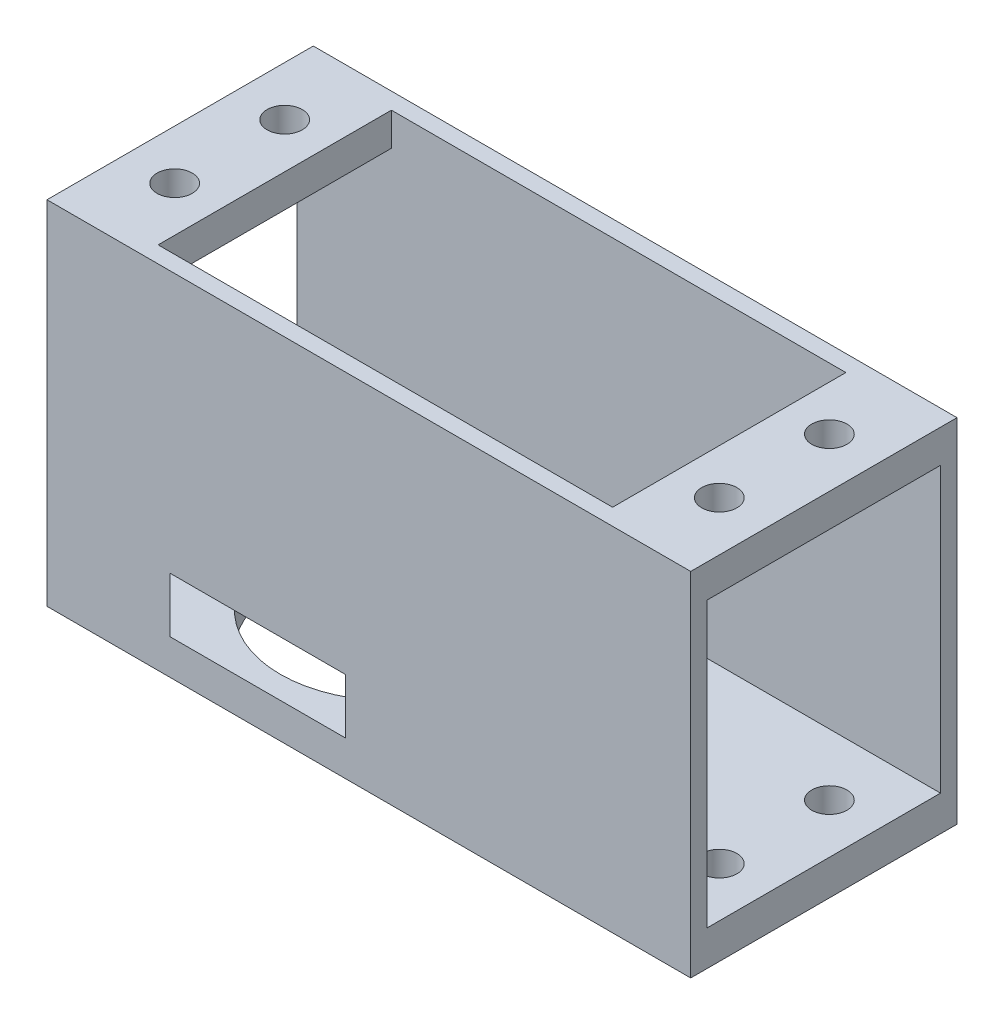
ISO-10303-21;
HEADER;
FILE_DESCRIPTION(('STEP AP214'),'2;1');
FILE_NAME('part.step','',(''),(''),'','','');
FILE_SCHEMA(('AUTOMOTIVE_DESIGN { 1 0 10303 214 1 1 1 1 }'));
ENDSEC;
DATA;
#1=APPLICATION_CONTEXT('core data for automotive mechanical design processes');
#2=APPLICATION_PROTOCOL_DEFINITION('international standard','automotive_design',2000,#1);
#3=PRODUCT_CONTEXT('',#1,'mechanical');
#4=PRODUCT('Part','Part','',(#3));
#5=PRODUCT_RELATED_PRODUCT_CATEGORY('part','',(#4));
#6=PRODUCT_DEFINITION_FORMATION('','',#4);
#7=PRODUCT_DEFINITION_CONTEXT('part definition',#1,'design');
#8=PRODUCT_DEFINITION('design','',#6,#7);
#9=PRODUCT_DEFINITION_SHAPE('','',#8);
#10=(LENGTH_UNIT() NAMED_UNIT(*) SI_UNIT(.MILLI.,.METRE.));
#11=(NAMED_UNIT(*) PLANE_ANGLE_UNIT() SI_UNIT($,.RADIAN.));
#12=(NAMED_UNIT(*) SI_UNIT($,.STERADIAN.) SOLID_ANGLE_UNIT());
#13=UNCERTAINTY_MEASURE_WITH_UNIT(LENGTH_MEASURE(1.E-05),#10,'distance_accuracy_value','');
#14=(GEOMETRIC_REPRESENTATION_CONTEXT(3) GLOBAL_UNCERTAINTY_ASSIGNED_CONTEXT((#13)) GLOBAL_UNIT_ASSIGNED_CONTEXT((#10,
#11,#12)) REPRESENTATION_CONTEXT('',''));
#15=CARTESIAN_POINT('',(0.,0.,0.));
#16=DIRECTION('',(0.,0.,1.));
#17=DIRECTION('',(1.,0.,0.));
#18=AXIS2_PLACEMENT_3D('',#15,#16,#17);
#19=CARTESIAN_POINT('',(-19.15,15.4,10.6));
#20=DIRECTION('',(0.,0.,-1.));
#21=DIRECTION('',(-1.,0.,0.));
#22=AXIS2_PLACEMENT_3D('',#19,#20,#21);
#23=PLANE('',#22);
#24=DIRECTION('',(0.,-1.,0.));
#25=VECTOR('',#24,1.);
#26=CARTESIAN_POINT('',(9.89393753770459,-500.,10.6));
#27=LINE('',#26,#25);
#28=CARTESIAN_POINT('',(9.89393753770459,20.4,10.6));
#29=VERTEX_POINT('',#28);
#30=CARTESIAN_POINT('',(9.89393753770459,15.4,10.6));
#31=VERTEX_POINT('',#30);
#32=EDGE_CURVE('E225',#29,#31,#27,.T.);
#33=ORIENTED_EDGE('',*,*,#32,.F.);
#34=DIRECTION('',(1.,0.,0.));
#35=VECTOR('',#34,1.);
#36=CARTESIAN_POINT('',(-19.15,20.4,10.6));
#37=LINE('',#36,#35);
#38=CARTESIAN_POINT('',(-9.89393753770459,20.4,10.6));
#39=VERTEX_POINT('',#38);
#40=EDGE_CURVE('E208',#39,#29,#37,.T.);
#41=ORIENTED_EDGE('',*,*,#40,.F.);
#42=DIRECTION('',(0.,-1.,0.));
#43=VECTOR('',#42,1.);
#44=CARTESIAN_POINT('',(-9.89393753770459,-500.,10.6));
#45=LINE('',#44,#43);
#46=CARTESIAN_POINT('',(-9.89393753770459,15.4,10.6));
#47=VERTEX_POINT('',#46);
#48=EDGE_CURVE('E217',#47,#39,#45,.F.);
#49=ORIENTED_EDGE('',*,*,#48,.F.);
#50=DIRECTION('',(1.,0.,0.));
#51=VECTOR('',#50,1.);
#52=CARTESIAN_POINT('',(-19.15,15.4,10.6));
#53=LINE('',#52,#51);
#54=CARTESIAN_POINT('',(-19.15,15.4,10.6));
#55=VERTEX_POINT('',#54);
#56=EDGE_CURVE('E357',#55,#47,#53,.T.);
#57=ORIENTED_EDGE('',*,*,#56,.F.);
#58=DIRECTION('',(0.,1.,0.));
#59=VECTOR('',#58,1.);
#60=CARTESIAN_POINT('',(-19.15,15.4,10.6));
#61=LINE('',#60,#59);
#62=CARTESIAN_POINT('',(-19.15,41.2,10.6));
#63=VERTEX_POINT('',#62);
#64=EDGE_CURVE('E348',#55,#63,#61,.T.);
#65=ORIENTED_EDGE('',*,*,#64,.T.);
#66=DIRECTION('',(1.,0.,0.));
#67=VECTOR('',#66,1.);
#68=CARTESIAN_POINT('',(-19.15,41.2,10.6));
#69=LINE('',#68,#67);
#70=CARTESIAN_POINT('',(-10.55,41.2,10.6));
#71=VERTEX_POINT('',#70);
#72=EDGE_CURVE('E267',#63,#71,#69,.T.);
#73=ORIENTED_EDGE('',*,*,#72,.T.);
#74=DIRECTION('',(0.,1.,0.));
#75=VECTOR('',#74,1.);
#76=CARTESIAN_POINT('',(-10.55,41.2,10.6));
#77=LINE('',#76,#75);
#78=CARTESIAN_POINT('',(-10.55,44.2,10.6));
#79=VERTEX_POINT('',#78);
#80=EDGE_CURVE('E275',#71,#79,#77,.T.);
#81=ORIENTED_EDGE('',*,*,#80,.T.);
#82=DIRECTION('',(1.,0.,0.));
#83=VECTOR('',#82,1.);
#84=CARTESIAN_POINT('',(-19.15,44.2,10.6));
#85=LINE('',#84,#83);
#86=CARTESIAN_POINT('',(30.75,44.2,10.6));
#87=VERTEX_POINT('',#86);
#88=EDGE_CURVE('E352',#79,#87,#85,.T.);
#89=ORIENTED_EDGE('',*,*,#88,.T.);
#90=DIRECTION('',(0.,-1.,0.));
#91=VECTOR('',#90,1.);
#92=CARTESIAN_POINT('',(30.75,44.2,10.6));
#93=LINE('',#92,#91);
#94=CARTESIAN_POINT('',(30.75,41.2,10.6));
#95=VERTEX_POINT('',#94);
#96=EDGE_CURVE('E302',#87,#95,#93,.T.);
#97=ORIENTED_EDGE('',*,*,#96,.T.);
#98=DIRECTION('',(1.,0.,0.));
#99=VECTOR('',#98,1.);
#100=CARTESIAN_POINT('',(30.75,41.2,10.6));
#101=LINE('',#100,#99);
#102=CARTESIAN_POINT('',(39.35,41.2,10.6));
#103=VERTEX_POINT('',#102);
#104=EDGE_CURVE('E297',#95,#103,#101,.T.);
#105=ORIENTED_EDGE('',*,*,#104,.T.);
#106=DIRECTION('',(0.,1.,0.));
#107=VECTOR('',#106,1.);
#108=CARTESIAN_POINT('',(39.35,15.4,10.6));
#109=LINE('',#108,#107);
#110=CARTESIAN_POINT('',(39.35,15.4,10.6));
#111=VERTEX_POINT('',#110);
#112=EDGE_CURVE('E330',#111,#103,#109,.T.);
#113=ORIENTED_EDGE('',*,*,#112,.F.);
#114=EDGE_CURVE('E359',#31,#111,#53,.T.);
#115=ORIENTED_EDGE('',*,*,#114,.F.);
#116=EDGE_LOOP('',(#33,#41,#49,#57,#65,#73,#81,#89,#97,#105,#113,#115));
#117=FACE_BOUND('',#116,.T.);
#118=ADVANCED_FACE('F41',(#117),#23,.T.);
#119=CARTESIAN_POINT('',(-19.15,44.2,12.1));
#120=DIRECTION('',(0.,0.,1.));
#121=DIRECTION('',(1.,0.,0.));
#122=AXIS2_PLACEMENT_3D('',#119,#120,#121);
#123=PLANE('',#122);
#124=DIRECTION('',(1.,0.,0.));
#125=VECTOR('',#124,1.);
#126=CARTESIAN_POINT('',(-19.15,15.4,12.1));
#127=LINE('',#126,#125);
#128=CARTESIAN_POINT('',(-7.98999374217527,15.4,12.1));
#129=VERTEX_POINT('',#128);
#130=CARTESIAN_POINT('',(7.98999374217527,15.4,12.1));
#131=VERTEX_POINT('',#130);
#132=EDGE_CURVE('E201',#129,#131,#127,.T.);
#133=ORIENTED_EDGE('',*,*,#132,.F.);
#134=DIRECTION('',(0.,-1.,0.));
#135=VECTOR('',#134,1.);
#136=CARTESIAN_POINT('',(-7.98999374217527,-500.,12.1));
#137=LINE('',#136,#135);
#138=CARTESIAN_POINT('',(-7.98999374217527,20.4,12.1));
#139=VERTEX_POINT('',#138);
#140=EDGE_CURVE('E216',#139,#129,#137,.T.);
#141=ORIENTED_EDGE('',*,*,#140,.F.);
#142=DIRECTION('',(-1.,0.,0.));
#143=VECTOR('',#142,1.);
#144=CARTESIAN_POINT('',(-19.15,20.4,12.1));
#145=LINE('',#144,#143);
#146=CARTESIAN_POINT('',(7.98999374217527,20.4,12.1));
#147=VERTEX_POINT('',#146);
#148=EDGE_CURVE('E206',#147,#139,#145,.T.);
#149=ORIENTED_EDGE('',*,*,#148,.F.);
#150=DIRECTION('',(0.,-1.,0.));
#151=VECTOR('',#150,1.);
#152=CARTESIAN_POINT('',(7.98999374217527,-500.,12.1));
#153=LINE('',#152,#151);
#154=EDGE_CURVE('E218',#131,#147,#153,.F.);
#155=ORIENTED_EDGE('',*,*,#154,.F.);
#156=EDGE_LOOP('',(#133,#141,#149,#155));
#157=FACE_BOUND('',#156,.T.);
#158=DIRECTION('',(1.,0.,0.));
#159=VECTOR('',#158,1.);
#160=CARTESIAN_POINT('',(-19.15,12.2,12.1));
#161=LINE('',#160,#159);
#162=CARTESIAN_POINT('',(-19.15,12.2,12.1));
#163=VERTEX_POINT('',#162);
#164=CARTESIAN_POINT('',(39.35,12.2,12.1));
#165=VERTEX_POINT('',#164);
#166=EDGE_CURVE('E349',#163,#165,#161,.T.);
#167=ORIENTED_EDGE('',*,*,#166,.T.);
#168=DIRECTION('',(0.,-1.,0.));
#169=VECTOR('',#168,1.);
#170=CARTESIAN_POINT('',(39.35,44.2,12.1));
#171=LINE('',#170,#169);
#172=CARTESIAN_POINT('',(39.35,44.2,12.1));
#173=VERTEX_POINT('',#172);
#174=EDGE_CURVE('E293',#173,#165,#171,.T.);
#175=ORIENTED_EDGE('',*,*,#174,.F.);
#176=DIRECTION('',(1.,0.,0.));
#177=VECTOR('',#176,1.);
#178=CARTESIAN_POINT('',(-19.15,44.2,12.1));
#179=LINE('',#178,#177);
#180=CARTESIAN_POINT('',(-19.15,44.2,12.1));
#181=VERTEX_POINT('',#180);
#182=EDGE_CURVE('E347',#181,#173,#179,.T.);
#183=ORIENTED_EDGE('',*,*,#182,.F.);
#184=DIRECTION('',(0.,-1.,0.));
#185=VECTOR('',#184,1.);
#186=CARTESIAN_POINT('',(-19.15,44.2,12.1));
#187=LINE('',#186,#185);
#188=EDGE_CURVE('E327',#181,#163,#187,.T.);
#189=ORIENTED_EDGE('',*,*,#188,.T.);
#190=EDGE_LOOP('',(#167,#175,#183,#189));
#191=FACE_BOUND('',#190,.T.);
#192=ADVANCED_FACE('F43',(#157,#191),#123,.T.);
#193=CARTESIAN_POINT('',(-19.15,44.2,10.6));
#194=DIRECTION('',(0.,1.,0.));
#195=DIRECTION('',(0.,0.,1.));
#196=AXIS2_PLACEMENT_3D('',#193,#194,#195);
#197=PLANE('',#196);
#198=CARTESIAN_POINT('',(-14.65,44.2,-5.));
#199=DIRECTION('',(0.,1.,0.));
#200=DIRECTION('',(0.,0.,1.));
#201=AXIS2_PLACEMENT_3D('',#198,#199,#200);
#202=CIRCLE('',#201,1.6);
#203=CARTESIAN_POINT('',(-14.65,44.2,-3.4));
#204=VERTEX_POINT('',#203);
#205=EDGE_CURVE('E244',#204,#204,#202,.T.);
#206=ORIENTED_EDGE('',*,*,#205,.F.);
#207=EDGE_LOOP('',(#206));
#208=FACE_BOUND('',#207,.T.);
#209=CARTESIAN_POINT('',(34.85,44.2,5.));
#210=DIRECTION('',(0.,1.,0.));
#211=DIRECTION('',(0.,0.,1.));
#212=AXIS2_PLACEMENT_3D('',#209,#210,#211);
#213=CIRCLE('',#212,1.6);
#214=CARTESIAN_POINT('',(34.85,44.2,6.6));
#215=VERTEX_POINT('',#214);
#216=EDGE_CURVE('E262',#215,#215,#213,.T.);
#217=ORIENTED_EDGE('',*,*,#216,.F.);
#218=EDGE_LOOP('',(#217));
#219=FACE_BOUND('',#218,.T.);
#220=CARTESIAN_POINT('',(34.85,44.2,-5.));
#221=DIRECTION('',(0.,1.,0.));
#222=DIRECTION('',(0.,0.,1.));
#223=AXIS2_PLACEMENT_3D('',#220,#221,#222);
#224=CIRCLE('',#223,1.6);
#225=CARTESIAN_POINT('',(34.85,44.2,-3.4));
#226=VERTEX_POINT('',#225);
#227=EDGE_CURVE('E253',#226,#226,#224,.T.);
#228=ORIENTED_EDGE('',*,*,#227,.F.);
#229=EDGE_LOOP('',(#228));
#230=FACE_BOUND('',#229,.T.);
#231=CARTESIAN_POINT('',(-14.65,44.2,5.));
#232=DIRECTION('',(0.,1.,0.));
#233=DIRECTION('',(0.,0.,1.));
#234=AXIS2_PLACEMENT_3D('',#231,#232,#233);
#235=CIRCLE('',#234,1.6);
#236=CARTESIAN_POINT('',(-14.65,44.2,6.6));
#237=VERTEX_POINT('',#236);
#238=EDGE_CURVE('E232',#237,#237,#235,.T.);
#239=ORIENTED_EDGE('',*,*,#238,.F.);
#240=EDGE_LOOP('',(#239));
#241=FACE_BOUND('',#240,.T.);
#242=ORIENTED_EDGE('',*,*,#88,.F.);
#243=DIRECTION('',(0.,0.,-1.));
#244=VECTOR('',#243,1.);
#245=CARTESIAN_POINT('',(-10.55,44.2,10.6));
#246=LINE('',#245,#244);
#247=CARTESIAN_POINT('',(-10.55,44.2,-10.6));
#248=VERTEX_POINT('',#247);
#249=EDGE_CURVE('E277',#79,#248,#246,.T.);
#250=ORIENTED_EDGE('',*,*,#249,.T.);
#251=DIRECTION('',(1.,0.,0.));
#252=VECTOR('',#251,1.);
#253=CARTESIAN_POINT('',(-19.15,44.2,-10.6));
#254=LINE('',#253,#252);
#255=CARTESIAN_POINT('',(30.75,44.2,-10.6));
#256=VERTEX_POINT('',#255);
#257=EDGE_CURVE('E364',#248,#256,#254,.T.);
#258=ORIENTED_EDGE('',*,*,#257,.T.);
#259=DIRECTION('',(0.,0.,-1.));
#260=VECTOR('',#259,1.);
#261=CARTESIAN_POINT('',(30.75,44.2,10.6));
#262=LINE('',#261,#260);
#263=EDGE_CURVE('E300',#87,#256,#262,.T.);
#264=ORIENTED_EDGE('',*,*,#263,.F.);
#265=EDGE_LOOP('',(#242,#250,#258,#264));
#266=FACE_BOUND('',#265,.T.);
#267=ORIENTED_EDGE('',*,*,#182,.T.);
#268=DIRECTION('',(0.,0.,1.));
#269=VECTOR('',#268,1.);
#270=CARTESIAN_POINT('',(39.35,44.2,-12.1));
#271=LINE('',#270,#269);
#272=CARTESIAN_POINT('',(39.35,44.2,-12.1));
#273=VERTEX_POINT('',#272);
#274=EDGE_CURVE('E316',#273,#173,#271,.T.);
#275=ORIENTED_EDGE('',*,*,#274,.F.);
#276=DIRECTION('',(1.,0.,0.));
#277=VECTOR('',#276,1.);
#278=CARTESIAN_POINT('',(-19.15,44.2,-12.1));
#279=LINE('',#278,#277);
#280=CARTESIAN_POINT('',(-19.15,44.2,-12.1));
#281=VERTEX_POINT('',#280);
#282=EDGE_CURVE('E370',#281,#273,#279,.T.);
#283=ORIENTED_EDGE('',*,*,#282,.F.);
#284=DIRECTION('',(0.,0.,1.));
#285=VECTOR('',#284,1.);
#286=CARTESIAN_POINT('',(-19.15,44.2,-12.1));
#287=LINE('',#286,#285);
#288=EDGE_CURVE('E339',#281,#181,#287,.T.);
#289=ORIENTED_EDGE('',*,*,#288,.T.);
#290=EDGE_LOOP('',(#267,#275,#283,#289));
#291=FACE_BOUND('',#290,.T.);
#292=ADVANCED_FACE('F421',(#208,#219,#230,#241,#266,#291),#197,.T.);
#293=CARTESIAN_POINT('',(-19.15,15.4,-10.6));
#294=DIRECTION('',(0.,1.,0.));
#295=DIRECTION('',(0.,0.,1.));
#296=AXIS2_PLACEMENT_3D('',#293,#294,#295);
#297=PLANE('',#296);
#298=CARTESIAN_POINT('',(-14.65,15.4,-5.));
#299=DIRECTION('',(0.,1.,0.));
#300=DIRECTION('',(0.,0.,1.));
#301=AXIS2_PLACEMENT_3D('',#298,#299,#300);
#302=CIRCLE('',#301,1.6);
#303=CARTESIAN_POINT('',(-14.65,15.4,-3.4));
#304=VERTEX_POINT('',#303);
#305=EDGE_CURVE('E245',#304,#304,#302,.T.);
#306=ORIENTED_EDGE('',*,*,#305,.F.);
#307=EDGE_LOOP('',(#306));
#308=FACE_BOUND('',#307,.T.);
#309=CARTESIAN_POINT('',(-14.65,15.4,5.));
#310=DIRECTION('',(0.,1.,0.));
#311=DIRECTION('',(0.,0.,1.));
#312=AXIS2_PLACEMENT_3D('',#309,#310,#311);
#313=CIRCLE('',#312,1.6);
#314=CARTESIAN_POINT('',(-14.65,15.4,6.6));
#315=VERTEX_POINT('',#314);
#316=EDGE_CURVE('E235',#315,#315,#313,.T.);
#317=ORIENTED_EDGE('',*,*,#316,.F.);
#318=EDGE_LOOP('',(#317));
#319=FACE_BOUND('',#318,.T.);
#320=CARTESIAN_POINT('',(0.,15.4,0.));
#321=DIRECTION('',(0.,-1.,0.));
#322=DIRECTION('',(0.,0.,-1.));
#323=AXIS2_PLACEMENT_3D('',#320,#321,#322);
#324=CIRCLE('',#323,14.5);
#325=CARTESIAN_POINT('',(-9.89393753770459,15.4,-10.6));
#326=VERTEX_POINT('',#325);
#327=CARTESIAN_POINT('',(-7.98999374217527,15.4,-12.1));
#328=VERTEX_POINT('',#327);
#329=EDGE_CURVE('E198',#326,#328,#324,.T.);
#330=ORIENTED_EDGE('',*,*,#329,.F.);
#331=DIRECTION('',(1.,0.,0.));
#332=VECTOR('',#331,1.);
#333=CARTESIAN_POINT('',(-19.15,15.4,-10.6));
#334=LINE('',#333,#332);
#335=CARTESIAN_POINT('',(-19.15,15.4,-10.6));
#336=VERTEX_POINT('',#335);
#337=EDGE_CURVE('E363',#336,#326,#334,.T.);
#338=ORIENTED_EDGE('',*,*,#337,.F.);
#339=DIRECTION('',(0.,0.,1.));
#340=VECTOR('',#339,1.);
#341=CARTESIAN_POINT('',(-19.15,15.4,-10.6));
#342=LINE('',#341,#340);
#343=EDGE_CURVE('E344',#336,#55,#342,.T.);
#344=ORIENTED_EDGE('',*,*,#343,.T.);
#345=ORIENTED_EDGE('',*,*,#56,.T.);
#346=EDGE_CURVE('E388',#129,#47,#324,.T.);
#347=ORIENTED_EDGE('',*,*,#346,.F.);
#348=ORIENTED_EDGE('',*,*,#132,.T.);
#349=EDGE_CURVE('E191',#31,#131,#324,.T.);
#350=ORIENTED_EDGE('',*,*,#349,.F.);
#351=ORIENTED_EDGE('',*,*,#114,.T.);
#352=DIRECTION('',(0.,0.,1.));
#353=VECTOR('',#352,1.);
#354=CARTESIAN_POINT('',(39.35,15.4,-10.6));
#355=LINE('',#354,#353);
#356=CARTESIAN_POINT('',(39.35,15.4,-10.6));
#357=VERTEX_POINT('',#356);
#358=EDGE_CURVE('E321',#357,#111,#355,.T.);
#359=ORIENTED_EDGE('',*,*,#358,.F.);
#360=CARTESIAN_POINT('',(9.89393753770459,15.4,-10.6));
#361=VERTEX_POINT('',#360);
#362=EDGE_CURVE('E194',#361,#357,#334,.T.);
#363=ORIENTED_EDGE('',*,*,#362,.F.);
#364=CARTESIAN_POINT('',(7.98999374217527,15.4,-12.1));
#365=VERTEX_POINT('',#364);
#366=EDGE_CURVE('E177',#365,#361,#324,.T.);
#367=ORIENTED_EDGE('',*,*,#366,.F.);
#368=DIRECTION('',(-1.,0.,0.));
#369=VECTOR('',#368,1.);
#370=CARTESIAN_POINT('',(-19.15,15.4,-12.1));
#371=LINE('',#370,#369);
#372=EDGE_CURVE('E188',#365,#328,#371,.T.);
#373=ORIENTED_EDGE('',*,*,#372,.T.);
#374=EDGE_LOOP('',(#330,#338,#344,#345,#347,#348,#350,#351,#359,#363,#367,#373));
#375=FACE_BOUND('',#374,.T.);
#376=CARTESIAN_POINT('',(0.,15.4,0.));
#377=DIRECTION('',(0.,1.,0.));
#378=DIRECTION('',(0.,0.,1.));
#379=AXIS2_PLACEMENT_3D('',#376,#377,#378);
#380=CIRCLE('',#379,10.05);
#381=CARTESIAN_POINT('',(0.,15.4,10.05));
#382=VERTEX_POINT('',#381);
#383=EDGE_CURVE('E224',#382,#382,#380,.T.);
#384=ORIENTED_EDGE('',*,*,#383,.F.);
#385=EDGE_LOOP('',(#384));
#386=FACE_BOUND('',#385,.T.);
#387=CARTESIAN_POINT('',(34.85,15.4,5.));
#388=DIRECTION('',(0.,1.,0.));
#389=DIRECTION('',(0.,0.,1.));
#390=AXIS2_PLACEMENT_3D('',#387,#388,#389);
#391=CIRCLE('',#390,1.6);
#392=CARTESIAN_POINT('',(34.85,15.4,6.6));
#393=VERTEX_POINT('',#392);
#394=EDGE_CURVE('E265',#393,#393,#391,.T.);
#395=ORIENTED_EDGE('',*,*,#394,.F.);
#396=EDGE_LOOP('',(#395));
#397=FACE_BOUND('',#396,.T.);
#398=CARTESIAN_POINT('',(34.85,15.4,-5.));
#399=DIRECTION('',(0.,1.,0.));
#400=DIRECTION('',(0.,0.,1.));
#401=AXIS2_PLACEMENT_3D('',#398,#399,#400);
#402=CIRCLE('',#401,1.6);
#403=CARTESIAN_POINT('',(34.85,15.4,-3.4));
#404=VERTEX_POINT('',#403);
#405=EDGE_CURVE('E255',#404,#404,#402,.T.);
#406=ORIENTED_EDGE('',*,*,#405,.F.);
#407=EDGE_LOOP('',(#406));
#408=FACE_BOUND('',#407,.T.);
#409=ADVANCED_FACE('F189',(#308,#319,#375,#386,#397,#408),#297,.T.);
#410=CARTESIAN_POINT('',(-19.15,44.2,-10.6));
#411=DIRECTION('',(0.,0.,1.));
#412=DIRECTION('',(1.,0.,0.));
#413=AXIS2_PLACEMENT_3D('',#410,#411,#412);
#414=PLANE('',#413);
#415=DIRECTION('',(0.,-1.,0.));
#416=VECTOR('',#415,1.);
#417=CARTESIAN_POINT('',(-9.89393753770459,-500.,-10.6));
#418=LINE('',#417,#416);
#419=CARTESIAN_POINT('',(-9.89393753770459,20.4,-10.6));
#420=VERTEX_POINT('',#419);
#421=EDGE_CURVE('E211',#420,#326,#418,.T.);
#422=ORIENTED_EDGE('',*,*,#421,.F.);
#423=DIRECTION('',(-1.,0.,0.));
#424=VECTOR('',#423,1.);
#425=CARTESIAN_POINT('',(-19.15,20.4,-10.6));
#426=LINE('',#425,#424);
#427=CARTESIAN_POINT('',(9.89393753770459,20.4,-10.6));
#428=VERTEX_POINT('',#427);
#429=EDGE_CURVE('E203',#428,#420,#426,.T.);
#430=ORIENTED_EDGE('',*,*,#429,.F.);
#431=DIRECTION('',(0.,-1.,0.));
#432=VECTOR('',#431,1.);
#433=CARTESIAN_POINT('',(9.89393753770459,-500.,-10.6));
#434=LINE('',#433,#432);
#435=EDGE_CURVE('E215',#361,#428,#434,.F.);
#436=ORIENTED_EDGE('',*,*,#435,.F.);
#437=ORIENTED_EDGE('',*,*,#362,.T.);
#438=DIRECTION('',(0.,-1.,0.));
#439=VECTOR('',#438,1.);
#440=CARTESIAN_POINT('',(39.35,44.2,-10.6));
#441=LINE('',#440,#439);
#442=CARTESIAN_POINT('',(39.35,41.2,-10.6));
#443=VERTEX_POINT('',#442);
#444=EDGE_CURVE('E322',#443,#357,#441,.T.);
#445=ORIENTED_EDGE('',*,*,#444,.F.);
#446=DIRECTION('',(1.,0.,0.));
#447=VECTOR('',#446,1.);
#448=CARTESIAN_POINT('',(30.75,41.2,-10.6));
#449=LINE('',#448,#447);
#450=CARTESIAN_POINT('',(30.75,41.2,-10.6));
#451=VERTEX_POINT('',#450);
#452=EDGE_CURVE('E301',#451,#443,#449,.T.);
#453=ORIENTED_EDGE('',*,*,#452,.F.);
#454=DIRECTION('',(0.,-1.,0.));
#455=VECTOR('',#454,1.);
#456=CARTESIAN_POINT('',(30.75,44.2,-10.6));
#457=LINE('',#456,#455);
#458=EDGE_CURVE('E278',#256,#451,#457,.T.);
#459=ORIENTED_EDGE('',*,*,#458,.F.);
#460=ORIENTED_EDGE('',*,*,#257,.F.);
#461=DIRECTION('',(0.,1.,0.));
#462=VECTOR('',#461,1.);
#463=CARTESIAN_POINT('',(-10.55,41.2,-10.6));
#464=LINE('',#463,#462);
#465=CARTESIAN_POINT('',(-10.55,41.2,-10.6));
#466=VERTEX_POINT('',#465);
#467=EDGE_CURVE('E271',#466,#248,#464,.T.);
#468=ORIENTED_EDGE('',*,*,#467,.F.);
#469=DIRECTION('',(1.,0.,0.));
#470=VECTOR('',#469,1.);
#471=CARTESIAN_POINT('',(-19.15,41.2,-10.6));
#472=LINE('',#471,#470);
#473=CARTESIAN_POINT('',(-19.15,41.2,-10.6));
#474=VERTEX_POINT('',#473);
#475=EDGE_CURVE('E280',#474,#466,#472,.T.);
#476=ORIENTED_EDGE('',*,*,#475,.F.);
#477=DIRECTION('',(0.,-1.,0.));
#478=VECTOR('',#477,1.);
#479=CARTESIAN_POINT('',(-19.15,44.2,-10.6));
#480=LINE('',#479,#478);
#481=EDGE_CURVE('E342',#474,#336,#480,.T.);
#482=ORIENTED_EDGE('',*,*,#481,.T.);
#483=ORIENTED_EDGE('',*,*,#337,.T.);
#484=EDGE_LOOP('',(#422,#430,#436,#437,#445,#453,#459,#460,#468,#476,#482,#483));
#485=FACE_BOUND('',#484,.T.);
#486=ADVANCED_FACE('F414',(#485),#414,.T.);
#487=CARTESIAN_POINT('',(-19.15,12.2,-12.1));
#488=DIRECTION('',(0.,0.,-1.));
#489=DIRECTION('',(-1.,0.,0.));
#490=AXIS2_PLACEMENT_3D('',#487,#488,#489);
#491=PLANE('',#490);
#492=ORIENTED_EDGE('',*,*,#372,.F.);
#493=DIRECTION('',(0.,-1.,0.));
#494=VECTOR('',#493,1.);
#495=CARTESIAN_POINT('',(7.98999374217527,-500.,-12.1));
#496=LINE('',#495,#494);
#497=CARTESIAN_POINT('',(7.98999374217527,20.4,-12.1));
#498=VERTEX_POINT('',#497);
#499=EDGE_CURVE('E11',#498,#365,#496,.T.);
#500=ORIENTED_EDGE('',*,*,#499,.F.);
#501=DIRECTION('',(1.,0.,0.));
#502=VECTOR('',#501,1.);
#503=CARTESIAN_POINT('',(-19.15,20.4,-12.1));
#504=LINE('',#503,#502);
#505=CARTESIAN_POINT('',(-7.98999374217527,20.4,-12.1));
#506=VERTEX_POINT('',#505);
#507=EDGE_CURVE('E353',#506,#498,#504,.T.);
#508=ORIENTED_EDGE('',*,*,#507,.F.);
#509=DIRECTION('',(0.,-1.,0.));
#510=VECTOR('',#509,1.);
#511=CARTESIAN_POINT('',(-7.98999374217527,-500.,-12.1));
#512=LINE('',#511,#510);
#513=EDGE_CURVE('E47',#328,#506,#512,.F.);
#514=ORIENTED_EDGE('',*,*,#513,.F.);
#515=EDGE_LOOP('',(#492,#500,#508,#514));
#516=FACE_BOUND('',#515,.T.);
#517=ORIENTED_EDGE('',*,*,#282,.T.);
#518=DIRECTION('',(0.,1.,0.));
#519=VECTOR('',#518,1.);
#520=CARTESIAN_POINT('',(39.35,12.2,-12.1));
#521=LINE('',#520,#519);
#522=CARTESIAN_POINT('',(39.35,12.2,-12.1));
#523=VERTEX_POINT('',#522);
#524=EDGE_CURVE('E317',#523,#273,#521,.T.);
#525=ORIENTED_EDGE('',*,*,#524,.F.);
#526=DIRECTION('',(1.,0.,0.));
#527=VECTOR('',#526,1.);
#528=CARTESIAN_POINT('',(-19.15,12.2,-12.1));
#529=LINE('',#528,#527);
#530=CARTESIAN_POINT('',(-19.15,12.2,-12.1));
#531=VERTEX_POINT('',#530);
#532=EDGE_CURVE('E367',#531,#523,#529,.T.);
#533=ORIENTED_EDGE('',*,*,#532,.F.);
#534=DIRECTION('',(0.,1.,0.));
#535=VECTOR('',#534,1.);
#536=CARTESIAN_POINT('',(-19.15,12.2,-12.1));
#537=LINE('',#536,#535);
#538=EDGE_CURVE('E337',#531,#281,#537,.T.);
#539=ORIENTED_EDGE('',*,*,#538,.T.);
#540=EDGE_LOOP('',(#517,#525,#533,#539));
#541=FACE_BOUND('',#540,.T.);
#542=ADVANCED_FACE('F196',(#516,#541),#491,.T.);
#543=CARTESIAN_POINT('',(-19.15,12.2,12.1));
#544=DIRECTION('',(0.,-1.,0.));
#545=DIRECTION('',(0.,0.,-1.));
#546=AXIS2_PLACEMENT_3D('',#543,#544,#545);
#547=PLANE('',#546);
#548=CARTESIAN_POINT('',(0.,12.2,0.));
#549=DIRECTION('',(0.,-1.,0.));
#550=DIRECTION('',(0.,0.,-1.));
#551=AXIS2_PLACEMENT_3D('',#548,#549,#550);
#552=CIRCLE('',#551,10.05);
#553=CARTESIAN_POINT('',(0.,12.2,-10.05));
#554=VERTEX_POINT('',#553);
#555=EDGE_CURVE('E222',#554,#554,#552,.T.);
#556=ORIENTED_EDGE('',*,*,#555,.F.);
#557=EDGE_LOOP('',(#556));
#558=FACE_BOUND('',#557,.T.);
#559=CARTESIAN_POINT('',(-14.65,12.2,-5.));
#560=DIRECTION('',(0.,-1.,0.));
#561=DIRECTION('',(0.,0.,-1.));
#562=AXIS2_PLACEMENT_3D('',#559,#560,#561);
#563=CIRCLE('',#562,1.6);
#564=CARTESIAN_POINT('',(-14.65,12.2,-6.6));
#565=VERTEX_POINT('',#564);
#566=EDGE_CURVE('E237',#565,#565,#563,.T.);
#567=ORIENTED_EDGE('',*,*,#566,.F.);
#568=EDGE_LOOP('',(#567));
#569=FACE_BOUND('',#568,.T.);
#570=CARTESIAN_POINT('',(34.85,12.2,5.));
#571=DIRECTION('',(0.,-1.,0.));
#572=DIRECTION('',(0.,0.,-1.));
#573=AXIS2_PLACEMENT_3D('',#570,#571,#572);
#574=CIRCLE('',#573,1.6);
#575=CARTESIAN_POINT('',(34.85,12.2,3.4));
#576=VERTEX_POINT('',#575);
#577=EDGE_CURVE('E256',#576,#576,#574,.T.);
#578=ORIENTED_EDGE('',*,*,#577,.F.);
#579=EDGE_LOOP('',(#578));
#580=FACE_BOUND('',#579,.T.);
#581=CARTESIAN_POINT('',(34.85,12.2,-5.));
#582=DIRECTION('',(0.,-1.,0.));
#583=DIRECTION('',(0.,0.,-1.));
#584=AXIS2_PLACEMENT_3D('',#581,#582,#583);
#585=CIRCLE('',#584,1.6);
#586=CARTESIAN_POINT('',(34.85,12.2,-6.6));
#587=VERTEX_POINT('',#586);
#588=EDGE_CURVE('E248',#587,#587,#585,.T.);
#589=ORIENTED_EDGE('',*,*,#588,.F.);
#590=EDGE_LOOP('',(#589));
#591=FACE_BOUND('',#590,.T.);
#592=CARTESIAN_POINT('',(-14.65,12.2,5.));
#593=DIRECTION('',(0.,-1.,0.));
#594=DIRECTION('',(0.,0.,-1.));
#595=AXIS2_PLACEMENT_3D('',#592,#593,#594);
#596=CIRCLE('',#595,1.6);
#597=CARTESIAN_POINT('',(-14.65,12.2,3.4));
#598=VERTEX_POINT('',#597);
#599=EDGE_CURVE('E230',#598,#598,#596,.T.);
#600=ORIENTED_EDGE('',*,*,#599,.F.);
#601=EDGE_LOOP('',(#600));
#602=FACE_BOUND('',#601,.T.);
#603=ORIENTED_EDGE('',*,*,#532,.T.);
#604=DIRECTION('',(0.,0.,-1.));
#605=VECTOR('',#604,1.);
#606=CARTESIAN_POINT('',(39.35,12.2,12.1));
#607=LINE('',#606,#605);
#608=EDGE_CURVE('E312',#165,#523,#607,.T.);
#609=ORIENTED_EDGE('',*,*,#608,.F.);
#610=ORIENTED_EDGE('',*,*,#166,.F.);
#611=DIRECTION('',(0.,0.,-1.));
#612=VECTOR('',#611,1.);
#613=CARTESIAN_POINT('',(-19.15,12.2,12.1));
#614=LINE('',#613,#612);
#615=EDGE_CURVE('E333',#163,#531,#614,.T.);
#616=ORIENTED_EDGE('',*,*,#615,.T.);
#617=EDGE_LOOP('',(#603,#609,#610,#616));
#618=FACE_BOUND('',#617,.T.);
#619=ADVANCED_FACE('F437',(#558,#569,#580,#591,#602,#618),#547,.T.);
#620=CARTESIAN_POINT('',(-19.15,0.,0.));
#621=DIRECTION('',(1.,0.,0.));
#622=DIRECTION('',(0.,0.,-1.));
#623=AXIS2_PLACEMENT_3D('',#620,#621,#622);
#624=PLANE('',#623);
#625=DIRECTION('',(0.,0.,-1.));
#626=VECTOR('',#625,1.);
#627=CARTESIAN_POINT('',(-19.15,41.2,10.6));
#628=LINE('',#627,#626);
#629=EDGE_CURVE('E288',#63,#474,#628,.T.);
#630=ORIENTED_EDGE('',*,*,#629,.F.);
#631=ORIENTED_EDGE('',*,*,#64,.F.);
#632=ORIENTED_EDGE('',*,*,#343,.F.);
#633=ORIENTED_EDGE('',*,*,#481,.F.);
#634=EDGE_LOOP('',(#630,#631,#632,#633));
#635=FACE_BOUND('',#634,.T.);
#636=ORIENTED_EDGE('',*,*,#188,.F.);
#637=ORIENTED_EDGE('',*,*,#288,.F.);
#638=ORIENTED_EDGE('',*,*,#538,.F.);
#639=ORIENTED_EDGE('',*,*,#615,.F.);
#640=EDGE_LOOP('',(#636,#637,#638,#639));
#641=FACE_BOUND('',#640,.T.);
#642=ADVANCED_FACE('F432',(#635,#641),#624,.F.);
#643=CARTESIAN_POINT('',(39.35,0.,0.));
#644=DIRECTION('',(1.,0.,0.));
#645=DIRECTION('',(0.,0.,-1.));
#646=AXIS2_PLACEMENT_3D('',#643,#644,#645);
#647=PLANE('',#646);
#648=ORIENTED_EDGE('',*,*,#274,.T.);
#649=ORIENTED_EDGE('',*,*,#174,.T.);
#650=ORIENTED_EDGE('',*,*,#608,.T.);
#651=ORIENTED_EDGE('',*,*,#524,.T.);
#652=EDGE_LOOP('',(#648,#649,#650,#651));
#653=FACE_BOUND('',#652,.T.);
#654=ORIENTED_EDGE('',*,*,#112,.T.);
#655=DIRECTION('',(0.,0.,-1.));
#656=VECTOR('',#655,1.);
#657=CARTESIAN_POINT('',(39.35,41.2,10.6));
#658=LINE('',#657,#656);
#659=EDGE_CURVE('E295',#103,#443,#658,.T.);
#660=ORIENTED_EDGE('',*,*,#659,.T.);
#661=ORIENTED_EDGE('',*,*,#444,.T.);
#662=ORIENTED_EDGE('',*,*,#358,.T.);
#663=EDGE_LOOP('',(#654,#660,#661,#662));
#664=FACE_BOUND('',#663,.T.);
#665=ADVANCED_FACE('F415',(#653,#664),#647,.T.);
#666=CARTESIAN_POINT('',(30.75,44.2,10.6));
#667=DIRECTION('',(1.,0.,0.));
#668=DIRECTION('',(0.,0.,-1.));
#669=AXIS2_PLACEMENT_3D('',#666,#667,#668);
#670=PLANE('',#669);
#671=ORIENTED_EDGE('',*,*,#458,.T.);
#672=DIRECTION('',(0.,0.,-1.));
#673=VECTOR('',#672,1.);
#674=CARTESIAN_POINT('',(30.75,41.2,10.6));
#675=LINE('',#674,#673);
#676=EDGE_CURVE('E268',#95,#451,#675,.T.);
#677=ORIENTED_EDGE('',*,*,#676,.F.);
#678=ORIENTED_EDGE('',*,*,#96,.F.);
#679=ORIENTED_EDGE('',*,*,#263,.T.);
#680=EDGE_LOOP('',(#671,#677,#678,#679));
#681=FACE_BOUND('',#680,.T.);
#682=ADVANCED_FACE('F419',(#681),#670,.F.);
#683=CARTESIAN_POINT('',(30.75,41.2,10.6));
#684=DIRECTION('',(0.,1.,0.));
#685=DIRECTION('',(0.,0.,1.));
#686=AXIS2_PLACEMENT_3D('',#683,#684,#685);
#687=PLANE('',#686);
#688=CARTESIAN_POINT('',(34.85,41.2,5.));
#689=DIRECTION('',(0.,1.,0.));
#690=DIRECTION('',(0.,0.,1.));
#691=AXIS2_PLACEMENT_3D('',#688,#689,#690);
#692=CIRCLE('',#691,1.6);
#693=CARTESIAN_POINT('',(34.85,41.2,6.6));
#694=VERTEX_POINT('',#693);
#695=EDGE_CURVE('E259',#694,#694,#692,.T.);
#696=ORIENTED_EDGE('',*,*,#695,.T.);
#697=EDGE_LOOP('',(#696));
#698=FACE_BOUND('',#697,.T.);
#699=CARTESIAN_POINT('',(34.85,41.2,-5.));
#700=DIRECTION('',(0.,1.,0.));
#701=DIRECTION('',(0.,0.,1.));
#702=AXIS2_PLACEMENT_3D('',#699,#700,#701);
#703=CIRCLE('',#702,1.6);
#704=CARTESIAN_POINT('',(34.85,41.2,-3.4));
#705=VERTEX_POINT('',#704);
#706=EDGE_CURVE('E247',#705,#705,#703,.T.);
#707=ORIENTED_EDGE('',*,*,#706,.T.);
#708=EDGE_LOOP('',(#707));
#709=FACE_BOUND('',#708,.T.);
#710=ORIENTED_EDGE('',*,*,#452,.T.);
#711=ORIENTED_EDGE('',*,*,#659,.F.);
#712=ORIENTED_EDGE('',*,*,#104,.F.);
#713=ORIENTED_EDGE('',*,*,#676,.T.);
#714=EDGE_LOOP('',(#710,#711,#712,#713));
#715=FACE_BOUND('',#714,.T.);
#716=ADVANCED_FACE('F416',(#698,#709,#715),#687,.F.);
#717=CARTESIAN_POINT('',(-19.15,41.2,10.6));
#718=DIRECTION('',(0.,1.,0.));
#719=DIRECTION('',(0.,0.,1.));
#720=AXIS2_PLACEMENT_3D('',#717,#718,#719);
#721=PLANE('',#720);
#722=CARTESIAN_POINT('',(-14.65,41.2,-5.));
#723=DIRECTION('',(0.,1.,0.));
#724=DIRECTION('',(0.,0.,1.));
#725=AXIS2_PLACEMENT_3D('',#722,#723,#724);
#726=CIRCLE('',#725,1.6);
#727=CARTESIAN_POINT('',(-14.65,41.2,-3.4));
#728=VERTEX_POINT('',#727);
#729=EDGE_CURVE('E238',#728,#728,#726,.T.);
#730=ORIENTED_EDGE('',*,*,#729,.T.);
#731=EDGE_LOOP('',(#730));
#732=FACE_BOUND('',#731,.T.);
#733=CARTESIAN_POINT('',(-14.65,41.2,5.));
#734=DIRECTION('',(0.,1.,0.));
#735=DIRECTION('',(0.,0.,1.));
#736=AXIS2_PLACEMENT_3D('',#733,#734,#735);
#737=CIRCLE('',#736,1.6);
#738=CARTESIAN_POINT('',(-14.65,41.2,6.6));
#739=VERTEX_POINT('',#738);
#740=EDGE_CURVE('E226',#739,#739,#737,.T.);
#741=ORIENTED_EDGE('',*,*,#740,.T.);
#742=EDGE_LOOP('',(#741));
#743=FACE_BOUND('',#742,.T.);
#744=ORIENTED_EDGE('',*,*,#475,.T.);
#745=DIRECTION('',(0.,0.,-1.));
#746=VECTOR('',#745,1.);
#747=CARTESIAN_POINT('',(-10.55,41.2,10.6));
#748=LINE('',#747,#746);
#749=EDGE_CURVE('E282',#71,#466,#748,.T.);
#750=ORIENTED_EDGE('',*,*,#749,.F.);
#751=ORIENTED_EDGE('',*,*,#72,.F.);
#752=ORIENTED_EDGE('',*,*,#629,.T.);
#753=EDGE_LOOP('',(#744,#750,#751,#752));
#754=FACE_BOUND('',#753,.T.);
#755=ADVANCED_FACE('F431',(#732,#743,#754),#721,.F.);
#756=CARTESIAN_POINT('',(-10.55,41.2,10.6));
#757=DIRECTION('',(-1.,0.,0.));
#758=DIRECTION('',(0.,0.,1.));
#759=AXIS2_PLACEMENT_3D('',#756,#757,#758);
#760=PLANE('',#759);
#761=ORIENTED_EDGE('',*,*,#467,.T.);
#762=ORIENTED_EDGE('',*,*,#249,.F.);
#763=ORIENTED_EDGE('',*,*,#80,.F.);
#764=ORIENTED_EDGE('',*,*,#749,.T.);
#765=EDGE_LOOP('',(#761,#762,#763,#764));
#766=FACE_BOUND('',#765,.T.);
#767=ADVANCED_FACE('F430',(#766),#760,.F.);
#768=CARTESIAN_POINT('',(-14.65,-54.2,5.));
#769=DIRECTION('',(0.,1.,0.));
#770=DIRECTION('',(0.,0.,1.));
#771=AXIS2_PLACEMENT_3D('',#768,#769,#770);
#772=CYLINDRICAL_SURFACE('',#771,1.6);
#773=ORIENTED_EDGE('',*,*,#238,.T.);
#774=EDGE_LOOP('',(#773));
#775=FACE_BOUND('',#774,.T.);
#776=ORIENTED_EDGE('',*,*,#740,.F.);
#777=EDGE_LOOP('',(#776));
#778=FACE_BOUND('',#777,.T.);
#779=ADVANCED_FACE('F492',(#775,#778),#772,.F.);
#780=CARTESIAN_POINT('',(-14.65,-54.2,-5.));
#781=DIRECTION('',(0.,1.,0.));
#782=DIRECTION('',(0.,0.,1.));
#783=AXIS2_PLACEMENT_3D('',#780,#781,#782);
#784=CYLINDRICAL_SURFACE('',#783,1.6);
#785=ORIENTED_EDGE('',*,*,#205,.T.);
#786=EDGE_LOOP('',(#785));
#787=FACE_BOUND('',#786,.T.);
#788=ORIENTED_EDGE('',*,*,#729,.F.);
#789=EDGE_LOOP('',(#788));
#790=FACE_BOUND('',#789,.T.);
#791=ADVANCED_FACE('F508',(#787,#790),#784,.F.);
#792=CARTESIAN_POINT('',(34.85,-54.2,-5.));
#793=DIRECTION('',(0.,1.,0.));
#794=DIRECTION('',(0.,0.,1.));
#795=AXIS2_PLACEMENT_3D('',#792,#793,#794);
#796=CYLINDRICAL_SURFACE('',#795,1.6);
#797=ORIENTED_EDGE('',*,*,#227,.T.);
#798=EDGE_LOOP('',(#797));
#799=FACE_BOUND('',#798,.T.);
#800=ORIENTED_EDGE('',*,*,#706,.F.);
#801=EDGE_LOOP('',(#800));
#802=FACE_BOUND('',#801,.T.);
#803=ADVANCED_FACE('F577',(#799,#802),#796,.F.);
#804=CARTESIAN_POINT('',(34.85,-54.2,5.));
#805=DIRECTION('',(0.,1.,0.));
#806=DIRECTION('',(0.,0.,1.));
#807=AXIS2_PLACEMENT_3D('',#804,#805,#806);
#808=CYLINDRICAL_SURFACE('',#807,1.6);
#809=ORIENTED_EDGE('',*,*,#216,.T.);
#810=EDGE_LOOP('',(#809));
#811=FACE_BOUND('',#810,.T.);
#812=ORIENTED_EDGE('',*,*,#695,.F.);
#813=EDGE_LOOP('',(#812));
#814=FACE_BOUND('',#813,.T.);
#815=ADVANCED_FACE('F495',(#811,#814),#808,.F.);
#816=ORIENTED_EDGE('',*,*,#316,.T.);
#817=EDGE_LOOP('',(#816));
#818=FACE_BOUND('',#817,.T.);
#819=ORIENTED_EDGE('',*,*,#599,.T.);
#820=EDGE_LOOP('',(#819));
#821=FACE_BOUND('',#820,.T.);
#822=ADVANCED_FACE('F487',(#818,#821),#772,.F.);
#823=ORIENTED_EDGE('',*,*,#405,.T.);
#824=EDGE_LOOP('',(#823));
#825=FACE_BOUND('',#824,.T.);
#826=ORIENTED_EDGE('',*,*,#588,.T.);
#827=EDGE_LOOP('',(#826));
#828=FACE_BOUND('',#827,.T.);
#829=ADVANCED_FACE('F493',(#825,#828),#796,.F.);
#830=ORIENTED_EDGE('',*,*,#394,.T.);
#831=EDGE_LOOP('',(#830));
#832=FACE_BOUND('',#831,.T.);
#833=ORIENTED_EDGE('',*,*,#577,.T.);
#834=EDGE_LOOP('',(#833));
#835=FACE_BOUND('',#834,.T.);
#836=ADVANCED_FACE('F506',(#832,#835),#808,.F.);
#837=ORIENTED_EDGE('',*,*,#305,.T.);
#838=EDGE_LOOP('',(#837));
#839=FACE_BOUND('',#838,.T.);
#840=ORIENTED_EDGE('',*,*,#566,.T.);
#841=EDGE_LOOP('',(#840));
#842=FACE_BOUND('',#841,.T.);
#843=ADVANCED_FACE('F501',(#839,#842),#784,.F.);
#844=CARTESIAN_POINT('',(0.,-16.4,0.));
#845=DIRECTION('',(0.,1.,0.));
#846=DIRECTION('',(0.,0.,1.));
#847=AXIS2_PLACEMENT_3D('',#844,#845,#846);
#848=CYLINDRICAL_SURFACE('',#847,10.05);
#849=ORIENTED_EDGE('',*,*,#383,.T.);
#850=EDGE_LOOP('',(#849));
#851=FACE_BOUND('',#850,.T.);
#852=ORIENTED_EDGE('',*,*,#555,.T.);
#853=EDGE_LOOP('',(#852));
#854=FACE_BOUND('',#853,.T.);
#855=ADVANCED_FACE('F504',(#851,#854),#848,.F.);
#856=CARTESIAN_POINT('',(14.5,20.4,0.));
#857=DIRECTION('',(0.,1.,0.));
#858=DIRECTION('',(0.,0.,1.));
#859=AXIS2_PLACEMENT_3D('',#856,#857,#858);
#860=PLANE('',#859);
#861=ORIENTED_EDGE('',*,*,#429,.T.);
#862=CARTESIAN_POINT('',(0.,20.4,0.));
#863=DIRECTION('',(0.,-1.,0.));
#864=DIRECTION('',(0.,0.,-1.));
#865=AXIS2_PLACEMENT_3D('',#862,#863,#864);
#866=CIRCLE('',#865,14.5);
#867=EDGE_CURVE('E383',#420,#506,#866,.T.);
#868=ORIENTED_EDGE('',*,*,#867,.T.);
#869=ORIENTED_EDGE('',*,*,#507,.T.);
#870=EDGE_CURVE('E181',#498,#428,#866,.T.);
#871=ORIENTED_EDGE('',*,*,#870,.T.);
#872=EDGE_LOOP('',(#861,#868,#869,#871));
#873=FACE_BOUND('',#872,.T.);
#874=ADVANCED_FACE('F389',(#873),#860,.F.);
#875=CARTESIAN_POINT('',(0.,-500.,0.));
#876=DIRECTION('',(0.,-1.,0.));
#877=DIRECTION('',(0.,0.,-1.));
#878=AXIS2_PLACEMENT_3D('',#875,#876,#877);
#879=CYLINDRICAL_SURFACE('',#878,14.5);
#880=ORIENTED_EDGE('',*,*,#421,.T.);
#881=ORIENTED_EDGE('',*,*,#329,.T.);
#882=ORIENTED_EDGE('',*,*,#513,.T.);
#883=ORIENTED_EDGE('',*,*,#867,.F.);
#884=EDGE_LOOP('',(#880,#881,#882,#883));
#885=FACE_BOUND('',#884,.T.);
#886=ADVANCED_FACE('F381',(#885),#879,.F.);
#887=ORIENTED_EDGE('',*,*,#435,.T.);
#888=ORIENTED_EDGE('',*,*,#870,.F.);
#889=ORIENTED_EDGE('',*,*,#499,.T.);
#890=ORIENTED_EDGE('',*,*,#366,.T.);
#891=EDGE_LOOP('',(#887,#888,#889,#890));
#892=FACE_BOUND('',#891,.T.);
#893=ADVANCED_FACE('F178',(#892),#879,.F.);
#894=ORIENTED_EDGE('',*,*,#48,.T.);
#895=EDGE_CURVE('E57',#139,#39,#866,.T.);
#896=ORIENTED_EDGE('',*,*,#895,.F.);
#897=ORIENTED_EDGE('',*,*,#140,.T.);
#898=ORIENTED_EDGE('',*,*,#346,.T.);
#899=EDGE_LOOP('',(#894,#896,#897,#898));
#900=FACE_BOUND('',#899,.T.);
#901=ADVANCED_FACE('F410',(#900),#879,.F.);
#902=ORIENTED_EDGE('',*,*,#32,.T.);
#903=ORIENTED_EDGE('',*,*,#349,.T.);
#904=ORIENTED_EDGE('',*,*,#154,.T.);
#905=EDGE_CURVE('E62',#29,#147,#866,.T.);
#906=ORIENTED_EDGE('',*,*,#905,.F.);
#907=EDGE_LOOP('',(#902,#903,#904,#906));
#908=FACE_BOUND('',#907,.T.);
#909=ADVANCED_FACE('F398',(#908),#879,.F.);
#910=ORIENTED_EDGE('',*,*,#40,.T.);
#911=ORIENTED_EDGE('',*,*,#905,.T.);
#912=ORIENTED_EDGE('',*,*,#148,.T.);
#913=ORIENTED_EDGE('',*,*,#895,.T.);
#914=EDGE_LOOP('',(#910,#911,#912,#913));
#915=FACE_BOUND('',#914,.T.);
#916=ADVANCED_FACE('F407',(#915),#860,.F.);
#917=CLOSED_SHELL('',(#118,#192,#292,#409,#486,#542,#619,#642,#665,#682,#716,#755,#767,#779,
#791,#803,#815,#822,#829,#836,#843,#855,#874,#886,#893,#901,#909,#916));
#918=MANIFOLD_SOLID_BREP('B2',#917);
#919=ADVANCED_BREP_SHAPE_REPRESENTATION('',(#18,#918),#14);
#920=SHAPE_DEFINITION_REPRESENTATION(#9,#919);
ENDSEC;
END-ISO-10303-21;
